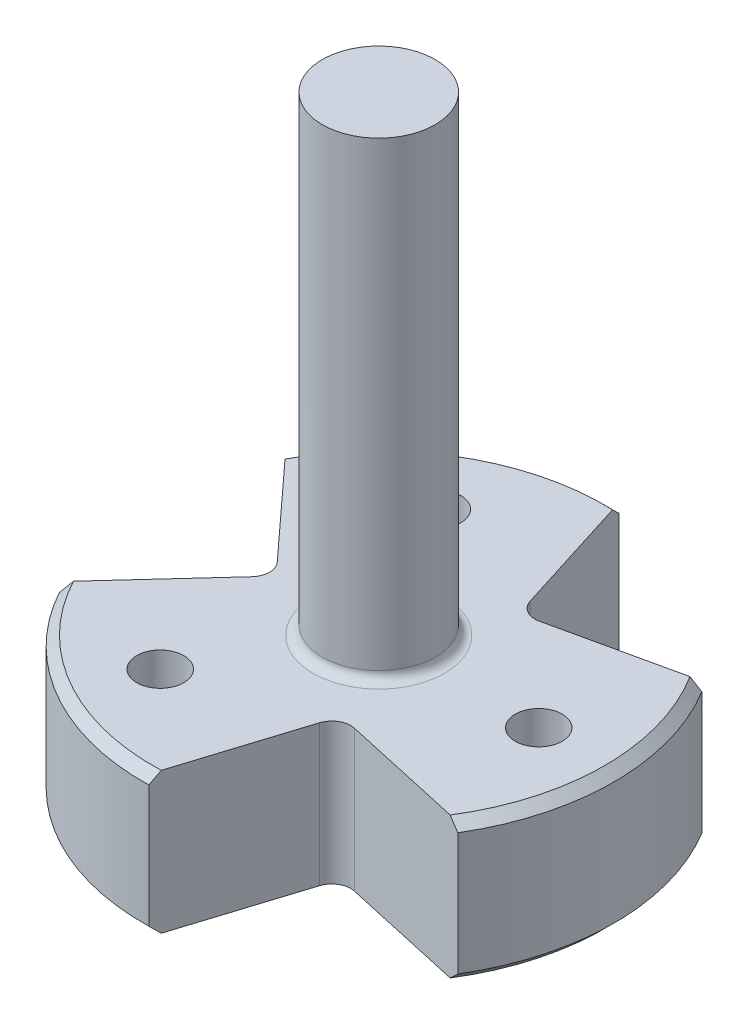
ISO-10303-21;
HEADER;
FILE_DESCRIPTION(('STEP AP214'),'2;1');
FILE_NAME('part.step','',(''),(''),'','','');
FILE_SCHEMA(('AUTOMOTIVE_DESIGN { 1 0 10303 214 1 1 1 1 }'));
ENDSEC;
DATA;
#1=APPLICATION_CONTEXT('core data for automotive mechanical design processes');
#2=APPLICATION_PROTOCOL_DEFINITION('international standard','automotive_design',2000,#1);
#3=PRODUCT_CONTEXT('',#1,'mechanical');
#4=PRODUCT('Part','Part','',(#3));
#5=PRODUCT_RELATED_PRODUCT_CATEGORY('part','',(#4));
#6=PRODUCT_DEFINITION_FORMATION('','',#4);
#7=PRODUCT_DEFINITION_CONTEXT('part definition',#1,'design');
#8=PRODUCT_DEFINITION('design','',#6,#7);
#9=PRODUCT_DEFINITION_SHAPE('','',#8);
#10=(LENGTH_UNIT() NAMED_UNIT(*) SI_UNIT(.MILLI.,.METRE.));
#11=(NAMED_UNIT(*) PLANE_ANGLE_UNIT() SI_UNIT($,.RADIAN.));
#12=(NAMED_UNIT(*) SI_UNIT($,.STERADIAN.) SOLID_ANGLE_UNIT());
#13=UNCERTAINTY_MEASURE_WITH_UNIT(LENGTH_MEASURE(1.E-05),#10,'distance_accuracy_value','');
#14=(GEOMETRIC_REPRESENTATION_CONTEXT(3) GLOBAL_UNCERTAINTY_ASSIGNED_CONTEXT((#13)) GLOBAL_UNIT_ASSIGNED_CONTEXT((#10,
#11,#12)) REPRESENTATION_CONTEXT('',''));
#15=CARTESIAN_POINT('',(0.,0.,0.));
#16=DIRECTION('',(0.,0.,1.));
#17=DIRECTION('',(1.,0.,0.));
#18=AXIS2_PLACEMENT_3D('',#15,#16,#17);
#19=CARTESIAN_POINT('',(-4.25407945152756,3.,2.83206765277555));
#20=DIRECTION('',(0.,-1.,0.));
#21=DIRECTION('',(1.,0.,0.));
#22=AXIS2_PLACEMENT_3D('',#19,#20,#21);
#23=PLANE('',#22);
#24=CARTESIAN_POINT('',(-4.25407945152756,3.,2.83206765277555));
#25=DIRECTION('',(0.,-1.,0.));
#26=DIRECTION('',(1.,0.,0.));
#27=AXIS2_PLACEMENT_3D('',#24,#25,#26);
#28=CIRCLE('',#27,5.45);
#29=CARTESIAN_POINT('',(1.19592054847244,3.,2.83206765277555));
#30=VERTEX_POINT('',#29);
#31=EDGE_CURVE('E168',#30,#30,#28,.T.);
#32=ORIENTED_EDGE('',*,*,#31,.T.);
#33=EDGE_LOOP('',(#32));
#34=FACE_BOUND('',#33,.T.);
#35=ADVANCED_FACE('F15',(#34),#23,.T.);
#36=CARTESIAN_POINT('',(-4.25407945152756,32.5,2.83206765277555));
#37=DIRECTION('',(0.,1.,0.));
#38=DIRECTION('',(-1.,0.,0.));
#39=AXIS2_PLACEMENT_3D('',#36,#37,#38);
#40=PLANE('',#39);
#41=CARTESIAN_POINT('',(-4.25407945152756,32.5,2.83206765277555));
#42=DIRECTION('',(0.,-1.,0.));
#43=DIRECTION('',(1.,0.,0.));
#44=AXIS2_PLACEMENT_3D('',#41,#42,#43);
#45=CIRCLE('',#44,3.);
#46=CARTESIAN_POINT('',(-1.25407945152756,32.5,2.83206765277555));
#47=VERTEX_POINT('',#46);
#48=EDGE_CURVE('E346',#47,#47,#45,.T.);
#49=ORIENTED_EDGE('',*,*,#48,.F.);
#50=EDGE_LOOP('',(#49));
#51=FACE_BOUND('',#50,.T.);
#52=ADVANCED_FACE('F198',(#51),#40,.T.);
#53=CARTESIAN_POINT('',(-4.25407945152756,3.,2.83206765277555));
#54=DIRECTION('',(0.,-1.,0.));
#55=DIRECTION('',(1.,0.,0.));
#56=AXIS2_PLACEMENT_3D('',#53,#54,#55);
#57=CYLINDRICAL_SURFACE('',#56,5.45);
#58=CARTESIAN_POINT('',(-4.25407945152756,0.,2.83206765277555));
#59=DIRECTION('',(0.,-1.,0.));
#60=DIRECTION('',(1.,0.,0.));
#61=AXIS2_PLACEMENT_3D('',#58,#59,#60);
#62=CIRCLE('',#61,5.45);
#63=CARTESIAN_POINT('',(1.19592054847244,0.,2.83206765277555));
#64=VERTEX_POINT('',#63);
#65=EDGE_CURVE('E356',#64,#64,#62,.F.);
#66=ORIENTED_EDGE('',*,*,#65,.F.);
#67=EDGE_LOOP('',(#66));
#68=FACE_BOUND('',#67,.T.);
#69=ORIENTED_EDGE('',*,*,#31,.F.);
#70=EDGE_LOOP('',(#69));
#71=FACE_BOUND('',#70,.T.);
#72=ADVANCED_FACE('F193',(#68,#71),#57,.F.);
#73=CARTESIAN_POINT('',(-4.25407945152756,0.499999999999996,2.83206765277555));
#74=DIRECTION('',(0.,1.,0.));
#75=DIRECTION('',(-1.,0.,0.));
#76=AXIS2_PLACEMENT_3D('',#73,#74,#75);
#77=CONICAL_SURFACE('',#76,12.4989345522635,0.785398163397452);
#78=CARTESIAN_POINT('',(-14.8554791429605,0.,-2.78796392827337));
#79=CARTESIAN_POINT('',(-14.915156095767,0.0832249289970279,-2.85306979842955));
#80=CARTESIAN_POINT('',(-14.9747984508444,0.166504060483685,-2.91813792344045));
#81=CARTESIAN_POINT('',(-15.0940139646226,0.33317072715202,-3.04819868216956));
#82=CARTESIAN_POINT('',(-15.1535871233245,0.416558262332026,-3.11319131588892));
#83=CARTESIAN_POINT('',(-15.2131256842984,0.499999999999993,-3.17814620446417));
#84=B_SPLINE_CURVE_WITH_KNOTS('',3,(#78,#79,#80,#81,#82,#83),.UNSPECIFIED.,.F.,.F.,(4,2,4),(0.,
0.364058190918852,0.728116376227242),.UNSPECIFIED.);
#85=CARTESIAN_POINT('',(-14.8554791429605,0.,-2.78796392827337));
#86=VERTEX_POINT('',#85);
#87=CARTESIAN_POINT('',(-15.2131256842984,0.499999999999993,-3.17814620446417));
#88=VERTEX_POINT('',#87);
#89=EDGE_CURVE('E177',#86,#88,#84,.T.);
#90=ORIENTED_EDGE('',*,*,#89,.T.);
#91=CARTESIAN_POINT('',(-4.25407945152756,0.499999999999994,2.83206765277555));
#92=DIRECTION('',(0.,-1.,0.));
#93=DIRECTION('',(0.,0.,-1.));
#94=AXIS2_PLACEMENT_3D('',#91,#92,#93);
#95=CIRCLE('',#94,12.4989345522635);
#96=CARTESIAN_POINT('',(-3.97955421768899,0.499999999999994,-9.66385171467202));
#97=VERTEX_POINT('',#96);
#98=EDGE_CURVE('E354',#97,#88,#95,.F.);
#99=ORIENTED_EDGE('',*,*,#98,.F.);
#100=CARTESIAN_POINT('',(-3.97955421768899,0.499999999999994,-9.66385171467202));
#101=CARTESIAN_POINT('',(-3.95307091456979,0.416558262332027,-9.57981236407621));
#102=CARTESIAN_POINT('',(-3.9265722220609,0.333170727152021,-9.49572417839703));
#103=CARTESIAN_POINT('',(-3.87354405785514,0.166504060483687,-9.32745013557532));
#104=CARTESIAN_POINT('',(-3.84701458615778,0.0832249289970301,-9.24326427843127));
#105=CARTESIAN_POINT('',(-3.82046972507027,0.,-9.15902958620236));
#106=B_SPLINE_CURVE_WITH_KNOTS('',3,(#100,#101,#102,#103,#104,#105),.UNSPECIFIED.,.F.,.F.,(4,2,
4),(0.,0.36405818530839,0.728116376227242),.UNSPECIFIED.);
#107=CARTESIAN_POINT('',(-3.82046972507027,0.,-9.15902958620236));
#108=VERTEX_POINT('',#107);
#109=EDGE_CURVE('E144',#97,#108,#106,.T.);
#110=ORIENTED_EDGE('',*,*,#109,.T.);
#111=CARTESIAN_POINT('',(-4.25407945152756,0.,2.83206765277555));
#112=DIRECTION('',(0.,1.,0.));
#113=DIRECTION('',(-1.,0.,0.));
#114=AXIS2_PLACEMENT_3D('',#111,#112,#113);
#115=CIRCLE('',#114,11.9989345522635);
#116=EDGE_CURVE('E464',#86,#108,#115,.F.);
#117=ORIENTED_EDGE('',*,*,#116,.F.);
#118=EDGE_LOOP('',(#90,#99,#110,#117));
#119=FACE_BOUND('',#118,.T.);
#120=ADVANCED_FACE('F187',(#119),#77,.T.);
#121=CARTESIAN_POINT('',(-4.25407945152756,0.499999999999992,2.83206765277555));
#122=DIRECTION('',(0.,1.,0.));
#123=DIRECTION('',(0.,0.,1.));
#124=AXIS2_PLACEMENT_3D('',#121,#122,#123);
#125=CONICAL_SURFACE('',#124,12.4989345522635,0.785398163397446);
#126=CARTESIAN_POINT('',(5.91371051344814,0.,-3.53899800515339));
#127=CARTESIAN_POINT('',(5.9999323273421,0.0832249289970256,-3.55812682722613));
#128=CARTESIAN_POINT('',(6.08610415411688,0.166504060483683,-3.57724455935926));
#129=CARTESIAN_POINT('',(6.25834783210088,0.333170727152018,-3.61545784345187));
#130=CARTESIAN_POINT('',(6.34441968331163,0.416558262332025,-3.63455339541169));
#131=CARTESIAN_POINT('',(6.43044154740475,0.499999999999992,-3.65363785743224));
#132=B_SPLINE_CURVE_WITH_KNOTS('',3,(#126,#127,#128,#129,#130,#131),.UNSPECIFIED.,.F.,.F.,(4,2,
4),(0.,0.364058190918851,0.728116376227241),.UNSPECIFIED.);
#133=CARTESIAN_POINT('',(5.91371051344814,0.,-3.53899800515339));
#134=VERTEX_POINT('',#133);
#135=CARTESIAN_POINT('',(6.43044154740475,0.499999999999992,-3.65363785743224));
#136=VERTEX_POINT('',#135);
#137=EDGE_CURVE('E410',#134,#136,#132,.T.);
#138=ORIENTED_EDGE('',*,*,#137,.T.);
#139=CARTESIAN_POINT('',(-4.25407945152756,0.49999999999999,2.83206765277555));
#140=DIRECTION('',(0.,-1.,0.));
#141=DIRECTION('',(0.,0.,-1.));
#142=AXIS2_PLACEMENT_3D('',#139,#140,#141);
#143=CIRCLE('',#142,12.4989345522635);
#144=CARTESIAN_POINT('',(6.4304415474047,0.49999999999999,9.31777316298343));
#145=VERTEX_POINT('',#144);
#146=EDGE_CURVE('E343',#145,#136,#143,.F.);
#147=ORIENTED_EDGE('',*,*,#146,.F.);
#148=CARTESIAN_POINT('',(6.4304415474047,0.49999999999999,9.31777316298343));
#149=CARTESIAN_POINT('',(6.34441968331158,0.416558262332023,9.29868870096288));
#150=CARTESIAN_POINT('',(6.25834783210083,0.333170727152016,9.27959314900306));
#151=CARTESIAN_POINT('',(6.08610415411683,0.166504060483683,9.24137986491045));
#152=CARTESIAN_POINT('',(5.99993232734205,0.0832249289970262,9.22226213277732));
#153=CARTESIAN_POINT('',(5.91371051344808,0.,9.20313331070458));
#154=B_SPLINE_CURVE_WITH_KNOTS('',3,(#148,#149,#150,#151,#152,#153),.UNSPECIFIED.,.F.,.F.,(4,2,
4),(0.,0.364058185308389,0.728116376227238),.UNSPECIFIED.);
#155=CARTESIAN_POINT('',(5.91371051344808,0.,9.20313331070458));
#156=VERTEX_POINT('',#155);
#157=EDGE_CURVE('E454',#145,#156,#154,.T.);
#158=ORIENTED_EDGE('',*,*,#157,.T.);
#159=CARTESIAN_POINT('',(-4.25407945152756,0.,2.83206765277555));
#160=DIRECTION('',(0.,1.,0.));
#161=DIRECTION('',(0.,0.,1.));
#162=AXIS2_PLACEMENT_3D('',#159,#160,#161);
#163=CIRCLE('',#162,11.9989345522635);
#164=EDGE_CURVE('E506',#134,#156,#163,.F.);
#165=ORIENTED_EDGE('',*,*,#164,.F.);
#166=EDGE_LOOP('',(#138,#147,#158,#165));
#167=FACE_BOUND('',#166,.T.);
#168=ADVANCED_FACE('F192',(#167),#125,.T.);
#169=CARTESIAN_POINT('',(-4.25407945152756,32.5,2.83206765277555));
#170=DIRECTION('',(0.,-1.,0.));
#171=DIRECTION('',(1.,0.,0.));
#172=AXIS2_PLACEMENT_3D('',#169,#170,#171);
#173=CYLINDRICAL_SURFACE('',#172,3.);
#174=ORIENTED_EDGE('',*,*,#48,.T.);
#175=EDGE_LOOP('',(#174));
#176=FACE_BOUND('',#175,.T.);
#177=CARTESIAN_POINT('',(-4.25407945152756,8.,2.83206765277555));
#178=DIRECTION('',(0.,-1.,0.));
#179=DIRECTION('',(0.,0.,-1.));
#180=AXIS2_PLACEMENT_3D('',#177,#178,#179);
#181=CIRCLE('',#180,3.);
#182=CARTESIAN_POINT('',(-4.25407945152756,8.,-0.16793234722445));
#183=VERTEX_POINT('',#182);
#184=EDGE_CURVE('E349',#183,#183,#181,.F.);
#185=ORIENTED_EDGE('',*,*,#184,.T.);
#186=EDGE_LOOP('',(#185));
#187=FACE_BOUND('',#186,.T.);
#188=ADVANCED_FACE('F574',(#176,#187),#173,.T.);
#189=CARTESIAN_POINT('',(-4.25407945152756,7.5,2.83206765277555));
#190=DIRECTION('',(0.,-1.,0.));
#191=DIRECTION('',(0.,0.,-1.));
#192=AXIS2_PLACEMENT_3D('',#189,#190,#191);
#193=CYLINDRICAL_SURFACE('',#192,12.4989345522635);
#194=DIRECTION('',(0.,1.,0.));
#195=VECTOR('',#194,1.);
#196=CARTESIAN_POINT('',(6.4304415474047,7.5,9.31777316298343));
#197=LINE('',#196,#195);
#198=CARTESIAN_POINT('',(6.4304415474047,7.00000000000001,9.31777316298343));
#199=VERTEX_POINT('',#198);
#200=EDGE_CURVE('E269',#199,#145,#197,.F.);
#201=ORIENTED_EDGE('',*,*,#200,.T.);
#202=ORIENTED_EDGE('',*,*,#146,.T.);
#203=DIRECTION('',(0.,1.,0.));
#204=VECTOR('',#203,1.);
#205=CARTESIAN_POINT('',(6.43044154740475,7.5,-3.65363785743224));
#206=LINE('',#205,#204);
#207=CARTESIAN_POINT('',(6.43044154740475,7.00000000000001,-3.65363785743224));
#208=VERTEX_POINT('',#207);
#209=EDGE_CURVE('E336',#136,#208,#206,.T.);
#210=ORIENTED_EDGE('',*,*,#209,.T.);
#211=CARTESIAN_POINT('',(-4.25407945152756,7.00000000000001,2.83206765277555));
#212=DIRECTION('',(0.,-1.,0.));
#213=DIRECTION('',(0.,0.,-1.));
#214=AXIS2_PLACEMENT_3D('',#211,#212,#213);
#215=CIRCLE('',#214,12.4989345522635);
#216=EDGE_CURVE('E333',#199,#208,#215,.F.);
#217=ORIENTED_EDGE('',*,*,#216,.F.);
#218=EDGE_LOOP('',(#201,#202,#210,#217));
#219=FACE_BOUND('',#218,.T.);
#220=ADVANCED_FACE('F572',(#219),#193,.T.);
#221=CARTESIAN_POINT('',(-0.850813049992108,7.5,8.72669797192718));
#222=DIRECTION('',(0.,-1.,0.));
#223=DIRECTION('',(0.,0.,-1.));
#224=AXIS2_PLACEMENT_3D('',#221,#222,#223);
#225=CYLINDRICAL_SURFACE('',#224,0.999999999999966);
#226=CARTESIAN_POINT('',(-0.850813049992108,7.5,8.72669797192718));
#227=DIRECTION('',(0.,-1.,0.));
#228=DIRECTION('',(0.,0.,-1.));
#229=AXIS2_PLACEMENT_3D('',#226,#227,#228);
#230=CIRCLE('',#229,0.999999999999966);
#231=CARTESIAN_POINT('',(-1.80457621470658,7.5,8.42613878368995));
#232=VERTEX_POINT('',#231);
#233=CARTESIAN_POINT('',(-0.634223359989151,7.5,7.75043524797203));
#234=VERTEX_POINT('',#233);
#235=EDGE_CURVE('E328',#232,#234,#230,.T.);
#236=ORIENTED_EDGE('',*,*,#235,.F.);
#237=DIRECTION('',(0.,1.,0.));
#238=VECTOR('',#237,1.);
#239=CARTESIAN_POINT('',(-1.80457621470658,7.5,8.42613878368995));
#240=LINE('',#239,#238);
#241=CARTESIAN_POINT('',(-1.80457621470658,0.,8.42613878368995));
#242=VERTEX_POINT('',#241);
#243=EDGE_CURVE('E265',#232,#242,#240,.F.);
#244=ORIENTED_EDGE('',*,*,#243,.T.);
#245=CARTESIAN_POINT('',(-0.850813049992108,0.,8.72669797192718));
#246=DIRECTION('',(0.,-1.,0.));
#247=DIRECTION('',(0.,0.,-1.));
#248=AXIS2_PLACEMENT_3D('',#245,#246,#247);
#249=CIRCLE('',#248,0.999999999999966);
#250=CARTESIAN_POINT('',(-0.634223359989157,0.,7.75043524797205));
#251=VERTEX_POINT('',#250);
#252=EDGE_CURVE('E487',#251,#242,#249,.F.);
#253=ORIENTED_EDGE('',*,*,#252,.F.);
#254=DIRECTION('',(0.,1.,0.));
#255=VECTOR('',#254,1.);
#256=CARTESIAN_POINT('',(-0.634223359989158,7.5,7.75043524797205));
#257=LINE('',#256,#255);
#258=EDGE_CURVE('E270',#251,#234,#257,.T.);
#259=ORIENTED_EDGE('',*,*,#258,.T.);
#260=EDGE_LOOP('',(#236,#244,#253,#259));
#261=FACE_BOUND('',#260,.T.);
#262=ADVANCED_FACE('F422',(#261),#225,.F.);
#263=CARTESIAN_POINT('',(-4.25407945152756,0.500000000000001,2.83206765277555));
#264=DIRECTION('',(0.,1.,0.));
#265=DIRECTION('',(0.,0.,1.));
#266=AXIS2_PLACEMENT_3D('',#263,#264,#265);
#267=CONICAL_SURFACE('',#266,12.4989345522635,0.785398163397448);
#268=CARTESIAN_POINT('',(-3.82046972507038,0.,14.8231648917535));
#269=CARTESIAN_POINT('',(-3.8470145861579,0.0832249289970286,14.9073995839824));
#270=CARTESIAN_POINT('',(-3.87354405785525,0.166504060483687,14.9915854411264));
#271=CARTESIAN_POINT('',(-3.92657222206102,0.333170727152025,15.1598594839481));
#272=CARTESIAN_POINT('',(-3.95307091456991,0.416558262332034,15.2439476696273));
#273=CARTESIAN_POINT('',(-3.97955421768911,0.500000000000003,15.3279870202231));
#274=B_SPLINE_CURVE_WITH_KNOTS('',3,(#268,#269,#270,#271,#272,#273),.UNSPECIFIED.,.F.,.F.,(4,2,
4),(0.,0.364058190918857,0.728116376227254),.UNSPECIFIED.);
#275=CARTESIAN_POINT('',(-3.82046972507038,0.,14.8231648917535));
#276=VERTEX_POINT('',#275);
#277=CARTESIAN_POINT('',(-3.97955421768911,0.500000000000002,15.3279870202231));
#278=VERTEX_POINT('',#277);
#279=EDGE_CURVE('E324',#276,#278,#274,.T.);
#280=ORIENTED_EDGE('',*,*,#279,.T.);
#281=CARTESIAN_POINT('',(-4.25407945152756,0.500000000000002,2.83206765277555));
#282=DIRECTION('',(0.,-1.,0.));
#283=DIRECTION('',(0.,0.,-1.));
#284=AXIS2_PLACEMENT_3D('',#281,#282,#283);
#285=CIRCLE('',#284,12.4989345522635);
#286=CARTESIAN_POINT('',(-15.2131256842985,0.500000000000002,8.84228151001516));
#287=VERTEX_POINT('',#286);
#288=EDGE_CURVE('E325',#287,#278,#285,.F.);
#289=ORIENTED_EDGE('',*,*,#288,.F.);
#290=CARTESIAN_POINT('',(-15.2131256842985,0.500000000000002,8.84228151001516));
#291=CARTESIAN_POINT('',(-15.1535871233245,0.416558262332033,8.77732662143991));
#292=CARTESIAN_POINT('',(-15.0940139646227,0.333170727152025,8.71233398772055));
#293=CARTESIAN_POINT('',(-14.9747984508444,0.166504060483688,8.58227322899145));
#294=CARTESIAN_POINT('',(-14.915156095767,0.0832249289970295,8.51720510398054));
#295=CARTESIAN_POINT('',(-14.8554791429606,0.,8.45209923382437));
#296=B_SPLINE_CURVE_WITH_KNOTS('',3,(#290,#291,#292,#293,#294,#295),.UNSPECIFIED.,.F.,.F.,(4,2,
4),(0.,0.364058185308395,0.728116376227251),.UNSPECIFIED.);
#297=CARTESIAN_POINT('',(-14.8554791429606,0.,8.45209923382437));
#298=VERTEX_POINT('',#297);
#299=EDGE_CURVE('E403',#287,#298,#296,.T.);
#300=ORIENTED_EDGE('',*,*,#299,.T.);
#301=CARTESIAN_POINT('',(-4.25407945152756,0.,2.83206765277555));
#302=DIRECTION('',(0.,1.,0.));
#303=DIRECTION('',(0.,0.,1.));
#304=AXIS2_PLACEMENT_3D('',#301,#302,#303);
#305=CIRCLE('',#304,11.9989345522635);
#306=EDGE_CURVE('E512',#276,#298,#305,.F.);
#307=ORIENTED_EDGE('',*,*,#306,.F.);
#308=EDGE_LOOP('',(#280,#289,#300,#307));
#309=FACE_BOUND('',#308,.T.);
#310=ADVANCED_FACE('F416',(#309),#267,.T.);
#311=CARTESIAN_POINT('',(-4.25407945152756,7.5,2.83206765277555));
#312=DIRECTION('',(0.,-1.,0.));
#313=DIRECTION('',(0.,0.,-1.));
#314=AXIS2_PLACEMENT_3D('',#311,#312,#313);
#315=CYLINDRICAL_SURFACE('',#314,12.4989345522635);
#316=DIRECTION('',(0.,1.,0.));
#317=VECTOR('',#316,1.);
#318=CARTESIAN_POINT('',(-3.97955421768911,7.5,15.3279870202231));
#319=LINE('',#318,#317);
#320=CARTESIAN_POINT('',(-3.97955421768911,7.,15.3279870202231));
#321=VERTEX_POINT('',#320);
#322=EDGE_CURVE('E319',#278,#321,#319,.T.);
#323=ORIENTED_EDGE('',*,*,#322,.T.);
#324=CARTESIAN_POINT('',(-4.25407945152756,7.,2.83206765277555));
#325=DIRECTION('',(0.,-1.,0.));
#326=DIRECTION('',(0.,0.,-1.));
#327=AXIS2_PLACEMENT_3D('',#324,#325,#326);
#328=CIRCLE('',#327,12.4989345522635);
#329=CARTESIAN_POINT('',(-15.2131256842985,7.,8.84228151001517));
#330=VERTEX_POINT('',#329);
#331=EDGE_CURVE('E317',#330,#321,#328,.F.);
#332=ORIENTED_EDGE('',*,*,#331,.F.);
#333=DIRECTION('',(0.,1.,0.));
#334=VECTOR('',#333,1.);
#335=CARTESIAN_POINT('',(-15.2131256842985,7.5,8.84228151001516));
#336=LINE('',#335,#334);
#337=EDGE_CURVE('E316',#330,#287,#336,.F.);
#338=ORIENTED_EDGE('',*,*,#337,.T.);
#339=ORIENTED_EDGE('',*,*,#288,.T.);
#340=EDGE_LOOP('',(#323,#332,#338,#339));
#341=FACE_BOUND('',#340,.T.);
#342=ADVANCED_FACE('F421',(#341),#315,.T.);
#343=CARTESIAN_POINT('',(-11.0606122545986,7.5,2.83206765277555));
#344=DIRECTION('',(0.,-1.,0.));
#345=DIRECTION('',(0.,0.,-1.));
#346=AXIS2_PLACEMENT_3D('',#343,#344,#345);
#347=CYLINDRICAL_SURFACE('',#346,0.999999999999998);
#348=DIRECTION('',(0.,1.,0.));
#349=VECTOR('',#348,1.);
#350=CARTESIAN_POINT('',(-10.3234387798871,7.5,3.50777118849352));
#351=LINE('',#350,#349);
#352=CARTESIAN_POINT('',(-10.3234387798871,0.,3.50777118849352));
#353=VERTEX_POINT('',#352);
#354=CARTESIAN_POINT('',(-10.3234387798871,7.5,3.50777118849352));
#355=VERTEX_POINT('',#354);
#356=EDGE_CURVE('E260',#353,#355,#351,.T.);
#357=ORIENTED_EDGE('',*,*,#356,.T.);
#358=CARTESIAN_POINT('',(-11.0606122545986,7.5,2.83206765277555));
#359=DIRECTION('',(0.,-1.,0.));
#360=DIRECTION('',(0.,0.,-1.));
#361=AXIS2_PLACEMENT_3D('',#358,#359,#360);
#362=CIRCLE('',#361,0.999999999999998);
#363=CARTESIAN_POINT('',(-10.3234387798871,7.5,2.15636411705758));
#364=VERTEX_POINT('',#363);
#365=EDGE_CURVE('E327',#364,#355,#362,.T.);
#366=ORIENTED_EDGE('',*,*,#365,.F.);
#367=DIRECTION('',(0.,1.,0.));
#368=VECTOR('',#367,1.);
#369=CARTESIAN_POINT('',(-10.3234387798871,7.5,2.15636411705758));
#370=LINE('',#369,#368);
#371=CARTESIAN_POINT('',(-10.3234387798871,0.,2.15636411705758));
#372=VERTEX_POINT('',#371);
#373=EDGE_CURVE('E255',#364,#372,#370,.F.);
#374=ORIENTED_EDGE('',*,*,#373,.T.);
#375=CARTESIAN_POINT('',(-11.0606122545986,0.,2.83206765277555));
#376=DIRECTION('',(0.,-1.,0.));
#377=DIRECTION('',(0.,0.,-1.));
#378=AXIS2_PLACEMENT_3D('',#375,#376,#377);
#379=CIRCLE('',#378,0.999999999999998);
#380=EDGE_CURVE('E353',#353,#372,#379,.F.);
#381=ORIENTED_EDGE('',*,*,#380,.F.);
#382=EDGE_LOOP('',(#357,#366,#374,#381));
#383=FACE_BOUND('',#382,.T.);
#384=ADVANCED_FACE('F475',(#383),#347,.F.);
#385=CARTESIAN_POINT('',(-0.850813049992015,7.5,-3.06256266637594));
#386=DIRECTION('',(0.,-1.,0.));
#387=DIRECTION('',(0.,0.,-1.));
#388=AXIS2_PLACEMENT_3D('',#385,#386,#387);
#389=CYLINDRICAL_SURFACE('',#388,0.999999999999955);
#390=DIRECTION('',(0.,1.,0.));
#391=VECTOR('',#390,1.);
#392=CARTESIAN_POINT('',(-1.80457621470649,7.5,-2.76200347813872));
#393=LINE('',#392,#391);
#394=CARTESIAN_POINT('',(-1.80457621470649,0.,-2.76200347813871));
#395=VERTEX_POINT('',#394);
#396=CARTESIAN_POINT('',(-1.80457621470647,7.5,-2.76200347813872));
#397=VERTEX_POINT('',#396);
#398=EDGE_CURVE('E250',#395,#397,#393,.T.);
#399=ORIENTED_EDGE('',*,*,#398,.T.);
#400=CARTESIAN_POINT('',(-0.850813049992015,7.5,-3.06256266637594));
#401=DIRECTION('',(0.,-1.,0.));
#402=DIRECTION('',(0.,0.,-1.));
#403=AXIS2_PLACEMENT_3D('',#400,#401,#402);
#404=CIRCLE('',#403,0.999999999999955);
#405=CARTESIAN_POINT('',(-0.634223359989001,7.5,-2.08629994242084));
#406=VERTEX_POINT('',#405);
#407=EDGE_CURVE('E357',#406,#397,#404,.T.);
#408=ORIENTED_EDGE('',*,*,#407,.F.);
#409=DIRECTION('',(0.,1.,0.));
#410=VECTOR('',#409,1.);
#411=CARTESIAN_POINT('',(-0.63422335998894,7.5,-2.08629994242085));
#412=LINE('',#411,#410);
#413=CARTESIAN_POINT('',(-0.634223359989001,0.,-2.08629994242084));
#414=VERTEX_POINT('',#413);
#415=EDGE_CURVE('E275',#406,#414,#412,.F.);
#416=ORIENTED_EDGE('',*,*,#415,.T.);
#417=CARTESIAN_POINT('',(-0.850813049992015,0.,-3.06256266637594));
#418=DIRECTION('',(0.,-1.,0.));
#419=DIRECTION('',(0.,0.,-1.));
#420=AXIS2_PLACEMENT_3D('',#417,#418,#419);
#421=CIRCLE('',#420,0.999999999999955);
#422=EDGE_CURVE('E502',#395,#414,#421,.F.);
#423=ORIENTED_EDGE('',*,*,#422,.F.);
#424=EDGE_LOOP('',(#399,#408,#416,#423));
#425=FACE_BOUND('',#424,.T.);
#426=ADVANCED_FACE('F501',(#425),#389,.F.);
#427=CARTESIAN_POINT('',(-4.25407945152756,7.5,2.83206765277555));
#428=DIRECTION('',(0.,-1.,0.));
#429=DIRECTION('',(0.,0.,-1.));
#430=AXIS2_PLACEMENT_3D('',#427,#428,#429);
#431=CYLINDRICAL_SURFACE('',#430,12.4989345522635);
#432=DIRECTION('',(0.,1.,0.));
#433=VECTOR('',#432,1.);
#434=CARTESIAN_POINT('',(-3.97955421768899,7.5,-9.66385171467202));
#435=LINE('',#434,#433);
#436=CARTESIAN_POINT('',(-3.97955421768899,6.99999999999999,-9.66385171467202));
#437=VERTEX_POINT('',#436);
#438=EDGE_CURVE('E302',#437,#97,#435,.F.);
#439=ORIENTED_EDGE('',*,*,#438,.T.);
#440=ORIENTED_EDGE('',*,*,#98,.T.);
#441=DIRECTION('',(0.,1.,0.));
#442=VECTOR('',#441,1.);
#443=CARTESIAN_POINT('',(-15.2131256842984,7.5,-3.17814620446417));
#444=LINE('',#443,#442);
#445=CARTESIAN_POINT('',(-15.2131256842984,6.99999999999999,-3.17814620446417));
#446=VERTEX_POINT('',#445);
#447=EDGE_CURVE('E309',#88,#446,#444,.T.);
#448=ORIENTED_EDGE('',*,*,#447,.T.);
#449=CARTESIAN_POINT('',(-4.25407945152756,6.99999999999999,2.83206765277555));
#450=DIRECTION('',(0.,-1.,0.));
#451=DIRECTION('',(0.,0.,-1.));
#452=AXIS2_PLACEMENT_3D('',#449,#450,#451);
#453=CIRCLE('',#452,12.4989345522635);
#454=EDGE_CURVE('E254',#437,#446,#453,.F.);
#455=ORIENTED_EDGE('',*,*,#454,.F.);
#456=EDGE_LOOP('',(#439,#440,#448,#455));
#457=FACE_BOUND('',#456,.T.);
#458=ADVANCED_FACE('F468',(#457),#431,.T.);
#459=CARTESIAN_POINT('',(-4.25407945152756,0.,2.83206765277555));
#460=DIRECTION('',(0.,-1.,0.));
#461=DIRECTION('',(0.,0.,-1.));
#462=AXIS2_PLACEMENT_3D('',#459,#460,#461);
#463=PLANE('',#462);
#464=DIRECTION('',(0.675703535717981,0.,-0.737173474711495));
#465=VECTOR('',#464,1.);
#466=CARTESIAN_POINT('',(-10.3234387798871,0.,3.50777118849352));
#467=LINE('',#466,#465);
#468=EDGE_CURVE('E259',#298,#353,#467,.T.);
#469=ORIENTED_EDGE('',*,*,#468,.T.);
#470=ORIENTED_EDGE('',*,*,#380,.T.);
#471=DIRECTION('',(-0.67570353571797,0.,-0.737173474711506));
#472=VECTOR('',#471,1.);
#473=CARTESIAN_POINT('',(-10.3234387798871,0.,2.15636411705758));
#474=LINE('',#473,#472);
#475=EDGE_CURVE('E258',#372,#86,#474,.T.);
#476=ORIENTED_EDGE('',*,*,#475,.T.);
#477=ORIENTED_EDGE('',*,*,#116,.T.);
#478=DIRECTION('',(0.300559188237224,0.,0.95376316471448));
#479=VECTOR('',#478,1.);
#480=CARTESIAN_POINT('',(-1.80457621470649,0.,-2.76200347813872));
#481=LINE('',#480,#479);
#482=EDGE_CURVE('E294',#108,#395,#481,.T.);
#483=ORIENTED_EDGE('',*,*,#482,.T.);
#484=ORIENTED_EDGE('',*,*,#422,.T.);
#485=DIRECTION('',(0.976262723955195,0.,-0.216589690002972));
#486=VECTOR('',#485,1.);
#487=CARTESIAN_POINT('',(-0.63422335998894,0.,-2.08629994242085));
#488=LINE('',#487,#486);
#489=EDGE_CURVE('E278',#414,#134,#488,.T.);
#490=ORIENTED_EDGE('',*,*,#489,.T.);
#491=ORIENTED_EDGE('',*,*,#164,.T.);
#492=DIRECTION('',(-0.976262723955196,0.,-0.216589690002966));
#493=VECTOR('',#492,1.);
#494=CARTESIAN_POINT('',(-0.634223359989157,0.,7.75043524797205));
#495=LINE('',#494,#493);
#496=EDGE_CURVE('E274',#156,#251,#495,.T.);
#497=ORIENTED_EDGE('',*,*,#496,.T.);
#498=ORIENTED_EDGE('',*,*,#252,.T.);
#499=DIRECTION('',(-0.300559188237233,0.,0.953763164714477));
#500=VECTOR('',#499,1.);
#501=CARTESIAN_POINT('',(-1.80457621470658,0.,8.42613878368995));
#502=LINE('',#501,#500);
#503=EDGE_CURVE('E268',#242,#276,#502,.T.);
#504=ORIENTED_EDGE('',*,*,#503,.T.);
#505=ORIENTED_EDGE('',*,*,#306,.T.);
#506=EDGE_LOOP('',(#469,#470,#476,#477,#483,#484,#490,#491,#497,#498,#504,#505));
#507=FACE_BOUND('',#506,.T.);
#508=CARTESIAN_POINT('',(-8.50407945152755,0.,10.1932835849433));
#509=DIRECTION('',(0.,1.,0.));
#510=DIRECTION('',(0.,0.,1.));
#511=AXIS2_PLACEMENT_3D('',#508,#509,#510);
#512=CIRCLE('',#511,1.24999999999999);
#513=CARTESIAN_POINT('',(-8.50407945152755,0.,11.4432835849433));
#514=VERTEX_POINT('',#513);
#515=EDGE_CURVE('E279',#514,#514,#512,.T.);
#516=ORIENTED_EDGE('',*,*,#515,.T.);
#517=EDGE_LOOP('',(#516));
#518=FACE_BOUND('',#517,.T.);
#519=CARTESIAN_POINT('',(4.24592054847243,0.,2.83206765277555));
#520=DIRECTION('',(0.,1.,0.));
#521=DIRECTION('',(0.,0.,1.));
#522=AXIS2_PLACEMENT_3D('',#519,#520,#521);
#523=CIRCLE('',#522,1.24999999999999);
#524=CARTESIAN_POINT('',(4.24592054847243,0.,4.08206765277554));
#525=VERTEX_POINT('',#524);
#526=EDGE_CURVE('E166',#525,#525,#523,.T.);
#527=ORIENTED_EDGE('',*,*,#526,.T.);
#528=EDGE_LOOP('',(#527));
#529=FACE_BOUND('',#528,.T.);
#530=CARTESIAN_POINT('',(-8.50407945152754,0.,-4.52914827939217));
#531=DIRECTION('',(0.,1.,0.));
#532=DIRECTION('',(0.,0.,1.));
#533=AXIS2_PLACEMENT_3D('',#530,#531,#532);
#534=CIRCLE('',#533,1.24999999999999);
#535=CARTESIAN_POINT('',(-8.50407945152754,0.,-3.27914827939219));
#536=VERTEX_POINT('',#535);
#537=EDGE_CURVE('E352',#536,#536,#534,.T.);
#538=ORIENTED_EDGE('',*,*,#537,.T.);
#539=EDGE_LOOP('',(#538));
#540=FACE_BOUND('',#539,.T.);
#541=ORIENTED_EDGE('',*,*,#65,.T.);
#542=EDGE_LOOP('',(#541));
#543=FACE_BOUND('',#542,.T.);
#544=ADVANCED_FACE('F287',(#507,#518,#529,#540,#543),#463,.T.);
#545=CARTESIAN_POINT('',(-4.25407945152756,8.,2.83206765277555));
#546=DIRECTION('',(0.,-1.,0.));
#547=DIRECTION('',(0.,0.,-1.));
#548=AXIS2_PLACEMENT_3D('',#545,#546,#547);
#549=TOROIDAL_SURFACE('',#548,3.5,0.5);
#550=CARTESIAN_POINT('',(-4.25407945152756,7.5,2.83206765277555));
#551=DIRECTION('',(0.,1.,0.));
#552=DIRECTION('',(0.,0.,1.));
#553=AXIS2_PLACEMENT_3D('',#550,#551,#552);
#554=CIRCLE('',#553,3.5);
#555=CARTESIAN_POINT('',(-4.25407945152756,7.5,6.33206765277555));
#556=VERTEX_POINT('',#555);
#557=CARTESIAN_POINT('',(-4.25407945152756,7.5,-0.66793234722445));
#558=VERTEX_POINT('',#557);
#559=EDGE_CURVE('E156',#556,#558,#554,.T.);
#560=ORIENTED_EDGE('',*,*,#559,.T.);
#561=CARTESIAN_POINT('',(-4.25407945152756,7.5,2.83206765277555));
#562=DIRECTION('',(0.,1.,0.));
#563=DIRECTION('',(0.,0.,-1.));
#564=AXIS2_PLACEMENT_3D('',#561,#562,#563);
#565=CIRCLE('',#564,3.5);
#566=EDGE_CURVE('E153',#558,#556,#565,.T.);
#567=ORIENTED_EDGE('',*,*,#566,.T.);
#568=EDGE_LOOP('',(#560,#567));
#569=FACE_BOUND('',#568,.T.);
#570=ORIENTED_EDGE('',*,*,#184,.F.);
#571=EDGE_LOOP('',(#570));
#572=FACE_BOUND('',#571,.T.);
#573=ADVANCED_FACE('F164',(#569,#572),#549,.F.);
#574=CARTESIAN_POINT('',(-8.50407945152754,7.5,-4.52914827939217));
#575=DIRECTION('',(0.,1.,0.));
#576=DIRECTION('',(0.,0.,1.));
#577=AXIS2_PLACEMENT_3D('',#574,#575,#576);
#578=CYLINDRICAL_SURFACE('',#577,1.24999999999999);
#579=ORIENTED_EDGE('',*,*,#537,.F.);
#580=EDGE_LOOP('',(#579));
#581=FACE_BOUND('',#580,.T.);
#582=CARTESIAN_POINT('',(-8.50407945152754,7.5,-4.52914827939217));
#583=DIRECTION('',(0.,1.,0.));
#584=DIRECTION('',(0.,0.,1.));
#585=AXIS2_PLACEMENT_3D('',#582,#583,#584);
#586=CIRCLE('',#585,1.24999999999999);
#587=CARTESIAN_POINT('',(-8.50407945152754,7.5,-3.27914827939219));
#588=VERTEX_POINT('',#587);
#589=EDGE_CURVE('E161',#588,#588,#586,.T.);
#590=ORIENTED_EDGE('',*,*,#589,.T.);
#591=EDGE_LOOP('',(#590));
#592=FACE_BOUND('',#591,.T.);
#593=ADVANCED_FACE('F286',(#581,#592),#578,.F.);
#594=CARTESIAN_POINT('',(-8.50407945152755,7.5,10.1932835849433));
#595=DIRECTION('',(0.,1.,0.));
#596=DIRECTION('',(0.,0.,1.));
#597=AXIS2_PLACEMENT_3D('',#594,#595,#596);
#598=CYLINDRICAL_SURFACE('',#597,1.24999999999999);
#599=ORIENTED_EDGE('',*,*,#515,.F.);
#600=EDGE_LOOP('',(#599));
#601=FACE_BOUND('',#600,.T.);
#602=CARTESIAN_POINT('',(-8.50407945152755,7.5,10.1932835849433));
#603=DIRECTION('',(0.,1.,0.));
#604=DIRECTION('',(0.,0.,1.));
#605=AXIS2_PLACEMENT_3D('',#602,#603,#604);
#606=CIRCLE('',#605,1.24999999999999);
#607=CARTESIAN_POINT('',(-8.50407945152755,7.5,11.4432835849433));
#608=VERTEX_POINT('',#607);
#609=EDGE_CURVE('E249',#608,#608,#606,.T.);
#610=ORIENTED_EDGE('',*,*,#609,.T.);
#611=EDGE_LOOP('',(#610));
#612=FACE_BOUND('',#611,.T.);
#613=ADVANCED_FACE('F524',(#601,#612),#598,.F.);
#614=CARTESIAN_POINT('',(-0.63422335998894,7.5,-2.08629994242085));
#615=DIRECTION('',(0.216589690002972,0.,0.976262723955195));
#616=DIRECTION('',(0.976262723955195,0.,-0.216589690002972));
#617=AXIS2_PLACEMENT_3D('',#614,#615,#616);
#618=PLANE('',#617);
#619=CARTESIAN_POINT('',(6.43044154740475,7.00000000000001,-3.65363785743224));
#620=CARTESIAN_POINT('',(6.34441968331163,7.08344173766797,-3.63455339541169));
#621=CARTESIAN_POINT('',(6.25834783210088,7.16682927284798,-3.61545784345187));
#622=CARTESIAN_POINT('',(6.08610415411688,7.33349593951632,-3.57724455935926));
#623=CARTESIAN_POINT('',(5.9999323273421,7.41677507100297,-3.55812682722613));
#624=CARTESIAN_POINT('',(5.91371051344814,7.5,-3.53899800515339));
#625=B_SPLINE_CURVE_WITH_KNOTS('',3,(#619,#620,#621,#622,#623,#624),.UNSPECIFIED.,.F.,.F.,(4,2,
4),(0.,0.364058185308391,0.728116376227242),.UNSPECIFIED.);
#626=CARTESIAN_POINT('',(5.91371051344813,7.5,-3.53899800515339));
#627=VERTEX_POINT('',#626);
#628=EDGE_CURVE('E335',#208,#627,#625,.T.);
#629=ORIENTED_EDGE('',*,*,#628,.F.);
#630=ORIENTED_EDGE('',*,*,#209,.F.);
#631=ORIENTED_EDGE('',*,*,#137,.F.);
#632=ORIENTED_EDGE('',*,*,#489,.F.);
#633=ORIENTED_EDGE('',*,*,#415,.F.);
#634=DIRECTION('',(0.976262723955194,0.,-0.216589690002973));
#635=VECTOR('',#634,1.);
#636=CARTESIAN_POINT('',(-0.63422335998894,7.5,-2.08629994242085));
#637=LINE('',#636,#635);
#638=EDGE_CURVE('E246',#406,#627,#637,.T.);
#639=ORIENTED_EDGE('',*,*,#638,.T.);
#640=EDGE_LOOP('',(#629,#630,#631,#632,#633,#639));
#641=FACE_BOUND('',#640,.T.);
#642=ADVANCED_FACE('F496',(#641),#618,.F.);
#643=CARTESIAN_POINT('',(-4.25407945152756,7.00000000000001,2.83206765277555));
#644=DIRECTION('',(0.,-1.,0.));
#645=DIRECTION('',(1.,0.,0.));
#646=AXIS2_PLACEMENT_3D('',#643,#644,#645);
#647=CONICAL_SURFACE('',#646,12.4989345522635,0.78539816339745);
#648=ORIENTED_EDGE('',*,*,#628,.T.);
#649=CARTESIAN_POINT('',(-4.25407945152756,7.5,2.83206765277555));
#650=DIRECTION('',(0.,-1.,0.));
#651=DIRECTION('',(1.,0.,0.));
#652=AXIS2_PLACEMENT_3D('',#649,#650,#651);
#653=CIRCLE('',#652,11.9989345522635);
#654=CARTESIAN_POINT('',(5.91371051344808,7.5,9.20313331070458));
#655=VERTEX_POINT('',#654);
#656=EDGE_CURVE('E245',#627,#655,#653,.T.);
#657=ORIENTED_EDGE('',*,*,#656,.T.);
#658=CARTESIAN_POINT('',(5.91371051344808,7.5,9.20313331070458));
#659=CARTESIAN_POINT('',(5.99993232734204,7.41677507100297,9.22226213277732));
#660=CARTESIAN_POINT('',(6.08610415411683,7.33349593951632,9.24137986491045));
#661=CARTESIAN_POINT('',(6.25834783210082,7.16682927284798,9.27959314900306));
#662=CARTESIAN_POINT('',(6.34441968331158,7.08344173766798,9.29868870096288));
#663=CARTESIAN_POINT('',(6.43044154740469,7.00000000000001,9.31777316298343));
#664=B_SPLINE_CURVE_WITH_KNOTS('',3,(#658,#659,#660,#661,#662,#663),.UNSPECIFIED.,.F.,.F.,(4,2,
4),(0.,0.364058190918851,0.728116376227241),.UNSPECIFIED.);
#665=EDGE_CURVE('E273',#655,#199,#664,.T.);
#666=ORIENTED_EDGE('',*,*,#665,.T.);
#667=ORIENTED_EDGE('',*,*,#216,.T.);
#668=EDGE_LOOP('',(#648,#657,#666,#667));
#669=FACE_BOUND('',#668,.T.);
#670=ADVANCED_FACE('F450',(#669),#647,.T.);
#671=CARTESIAN_POINT('',(-0.634223359989157,7.5,7.75043524797205));
#672=DIRECTION('',(0.216589690002966,0.,-0.976262723955196));
#673=DIRECTION('',(-0.976262723955196,0.,-0.216589690002966));
#674=AXIS2_PLACEMENT_3D('',#671,#672,#673);
#675=PLANE('',#674);
#676=ORIENTED_EDGE('',*,*,#665,.F.);
#677=DIRECTION('',(-0.976262723955195,0.,-0.216589690002971));
#678=VECTOR('',#677,1.);
#679=CARTESIAN_POINT('',(5.91371051344808,7.5,9.20313331070458));
#680=LINE('',#679,#678);
#681=EDGE_CURVE('E242',#655,#234,#680,.T.);
#682=ORIENTED_EDGE('',*,*,#681,.T.);
#683=ORIENTED_EDGE('',*,*,#258,.F.);
#684=ORIENTED_EDGE('',*,*,#496,.F.);
#685=ORIENTED_EDGE('',*,*,#157,.F.);
#686=ORIENTED_EDGE('',*,*,#200,.F.);
#687=EDGE_LOOP('',(#676,#682,#683,#684,#685,#686));
#688=FACE_BOUND('',#687,.T.);
#689=ADVANCED_FACE('F445',(#688),#675,.F.);
#690=CARTESIAN_POINT('',(-1.80457621470658,7.5,8.42613878368995));
#691=DIRECTION('',(-0.953763164714477,0.,-0.300559188237233));
#692=DIRECTION('',(-0.300559188237233,0.,0.953763164714477));
#693=AXIS2_PLACEMENT_3D('',#690,#691,#692);
#694=PLANE('',#693);
#695=ORIENTED_EDGE('',*,*,#279,.F.);
#696=ORIENTED_EDGE('',*,*,#503,.F.);
#697=ORIENTED_EDGE('',*,*,#243,.F.);
#698=DIRECTION('',(-0.300559188237233,0.,0.953763164714477));
#699=VECTOR('',#698,1.);
#700=CARTESIAN_POINT('',(-1.80457621470658,7.5,8.42613878368995));
#701=LINE('',#700,#699);
#702=CARTESIAN_POINT('',(-3.82046972507038,7.5,14.8231648917535));
#703=VERTEX_POINT('',#702);
#704=EDGE_CURVE('E239',#232,#703,#701,.T.);
#705=ORIENTED_EDGE('',*,*,#704,.T.);
#706=CARTESIAN_POINT('',(-3.97955421768911,7.,15.3279870202231));
#707=CARTESIAN_POINT('',(-3.95307091456991,7.08344173766797,15.2439476696273));
#708=CARTESIAN_POINT('',(-3.92657222206102,7.16682927284798,15.1598594839481));
#709=CARTESIAN_POINT('',(-3.87354405785525,7.33349593951631,14.9915854411264));
#710=CARTESIAN_POINT('',(-3.8470145861579,7.41677507100297,14.9073995839824));
#711=CARTESIAN_POINT('',(-3.82046972507038,7.5,14.8231648917534));
#712=B_SPLINE_CURVE_WITH_KNOTS('',3,(#706,#707,#708,#709,#710,#711),.UNSPECIFIED.,.F.,.F.,(4,2,
4),(0.,0.364058185308394,0.72811637622725),.UNSPECIFIED.);
#713=EDGE_CURVE('E264',#321,#703,#712,.T.);
#714=ORIENTED_EDGE('',*,*,#713,.F.);
#715=ORIENTED_EDGE('',*,*,#322,.F.);
#716=EDGE_LOOP('',(#695,#696,#697,#705,#714,#715));
#717=FACE_BOUND('',#716,.T.);
#718=ADVANCED_FACE('F442',(#717),#694,.F.);
#719=CARTESIAN_POINT('',(-4.25407945152756,7.,2.83206765277555));
#720=DIRECTION('',(0.,-1.,0.));
#721=DIRECTION('',(1.,0.,0.));
#722=AXIS2_PLACEMENT_3D('',#719,#720,#721);
#723=CONICAL_SURFACE('',#722,12.4989345522635,0.785398163397454);
#724=ORIENTED_EDGE('',*,*,#713,.T.);
#725=CARTESIAN_POINT('',(-4.25407945152756,7.5,2.83206765277555));
#726=DIRECTION('',(0.,-1.,0.));
#727=DIRECTION('',(1.,0.,0.));
#728=AXIS2_PLACEMENT_3D('',#725,#726,#727);
#729=CIRCLE('',#728,11.9989345522635);
#730=CARTESIAN_POINT('',(-14.8554791429606,7.5,8.45209923382437));
#731=VERTEX_POINT('',#730);
#732=EDGE_CURVE('E238',#703,#731,#729,.T.);
#733=ORIENTED_EDGE('',*,*,#732,.T.);
#734=CARTESIAN_POINT('',(-14.8554791429606,7.5,8.45209923382437));
#735=CARTESIAN_POINT('',(-14.915156095767,7.41677507100297,8.51720510398054));
#736=CARTESIAN_POINT('',(-14.9747984508444,7.33349593951631,8.58227322899145));
#737=CARTESIAN_POINT('',(-15.0940139646227,7.16682927284798,8.71233398772055));
#738=CARTESIAN_POINT('',(-15.1535871233245,7.08344173766797,8.77732662143991));
#739=CARTESIAN_POINT('',(-15.2131256842985,7.,8.84228151001517));
#740=B_SPLINE_CURVE_WITH_KNOTS('',3,(#734,#735,#736,#737,#738,#739),.UNSPECIFIED.,.F.,.F.,(4,2,
4),(0.,0.364058190918854,0.728116376227248),.UNSPECIFIED.);
#741=EDGE_CURVE('E263',#731,#330,#740,.T.);
#742=ORIENTED_EDGE('',*,*,#741,.T.);
#743=ORIENTED_EDGE('',*,*,#331,.T.);
#744=EDGE_LOOP('',(#724,#733,#742,#743));
#745=FACE_BOUND('',#744,.T.);
#746=ADVANCED_FACE('F393',(#745),#723,.T.);
#747=CARTESIAN_POINT('',(-10.3234387798871,7.5,3.50777118849352));
#748=DIRECTION('',(0.737173474711495,0.,0.675703535717981));
#749=DIRECTION('',(0.675703535717981,0.,-0.737173474711495));
#750=AXIS2_PLACEMENT_3D('',#747,#748,#749);
#751=PLANE('',#750);
#752=ORIENTED_EDGE('',*,*,#299,.F.);
#753=ORIENTED_EDGE('',*,*,#337,.F.);
#754=ORIENTED_EDGE('',*,*,#741,.F.);
#755=DIRECTION('',(0.675703535717981,0.,-0.737173474711495));
#756=VECTOR('',#755,1.);
#757=CARTESIAN_POINT('',(-14.8554791429606,7.5,8.45209923382437));
#758=LINE('',#757,#756);
#759=EDGE_CURVE('E235',#731,#355,#758,.T.);
#760=ORIENTED_EDGE('',*,*,#759,.T.);
#761=ORIENTED_EDGE('',*,*,#356,.F.);
#762=ORIENTED_EDGE('',*,*,#468,.F.);
#763=EDGE_LOOP('',(#752,#753,#754,#760,#761,#762));
#764=FACE_BOUND('',#763,.T.);
#765=ADVANCED_FACE('F387',(#764),#751,.F.);
#766=CARTESIAN_POINT('',(-10.3234387798871,7.5,2.15636411705758));
#767=DIRECTION('',(0.737173474711506,0.,-0.67570353571797));
#768=DIRECTION('',(-0.67570353571797,0.,-0.737173474711506));
#769=AXIS2_PLACEMENT_3D('',#766,#767,#768);
#770=PLANE('',#769);
#771=ORIENTED_EDGE('',*,*,#89,.F.);
#772=ORIENTED_EDGE('',*,*,#475,.F.);
#773=ORIENTED_EDGE('',*,*,#373,.F.);
#774=DIRECTION('',(-0.675703535717969,0.,-0.737173474711506));
#775=VECTOR('',#774,1.);
#776=CARTESIAN_POINT('',(-10.3234387798871,7.5,2.15636411705758));
#777=LINE('',#776,#775);
#778=CARTESIAN_POINT('',(-14.8554791429605,7.5,-2.78796392827336));
#779=VERTEX_POINT('',#778);
#780=EDGE_CURVE('E232',#364,#779,#777,.T.);
#781=ORIENTED_EDGE('',*,*,#780,.T.);
#782=CARTESIAN_POINT('',(-15.2131256842984,6.99999999999999,-3.17814620446417));
#783=CARTESIAN_POINT('',(-15.1535871233245,7.08344173766796,-3.11319131588892));
#784=CARTESIAN_POINT('',(-15.0940139646226,7.16682927284797,-3.04819868216956));
#785=CARTESIAN_POINT('',(-14.9747984508444,7.33349593951631,-2.91813792344045));
#786=CARTESIAN_POINT('',(-14.915156095767,7.41677507100297,-2.85306979842954));
#787=CARTESIAN_POINT('',(-14.8554791429605,7.5,-2.78796392827336));
#788=B_SPLINE_CURVE_WITH_KNOTS('',3,(#782,#783,#784,#785,#786,#787),.UNSPECIFIED.,.F.,.F.,(4,2,
4),(0.,0.364058185308403,0.728116376227267),.UNSPECIFIED.);
#789=EDGE_CURVE('E304',#446,#779,#788,.T.);
#790=ORIENTED_EDGE('',*,*,#789,.F.);
#791=ORIENTED_EDGE('',*,*,#447,.F.);
#792=EDGE_LOOP('',(#771,#772,#773,#781,#790,#791));
#793=FACE_BOUND('',#792,.T.);
#794=ADVANCED_FACE('F382',(#793),#770,.F.);
#795=CARTESIAN_POINT('',(-4.25407945152756,6.99999999999999,2.83206765277555));
#796=DIRECTION('',(0.,-1.,0.));
#797=DIRECTION('',(0.,0.,-1.));
#798=AXIS2_PLACEMENT_3D('',#795,#796,#797);
#799=CONICAL_SURFACE('',#798,12.4989345522635,0.785398163397444);
#800=CARTESIAN_POINT('',(-3.82046972507027,7.5,-9.15902958620235));
#801=CARTESIAN_POINT('',(-3.84701458615778,7.41677507100297,-9.24326427843127));
#802=CARTESIAN_POINT('',(-3.87354405785513,7.33349593951631,-9.32745013557531));
#803=CARTESIAN_POINT('',(-3.9265722220609,7.16682927284797,-9.49572417839703));
#804=CARTESIAN_POINT('',(-3.95307091456979,7.08344173766796,-9.57981236407621));
#805=CARTESIAN_POINT('',(-3.97955421768899,6.99999999999999,-9.66385171467202));
#806=B_SPLINE_CURVE_WITH_KNOTS('',3,(#800,#801,#802,#803,#804,#805),.UNSPECIFIED.,.F.,.F.,(4,2,
4),(0.,0.364058190918864,0.728116376227266),.UNSPECIFIED.);
#807=CARTESIAN_POINT('',(-3.82046972507027,7.5,-9.15902958620235));
#808=VERTEX_POINT('',#807);
#809=EDGE_CURVE('E253',#808,#437,#806,.T.);
#810=ORIENTED_EDGE('',*,*,#809,.T.);
#811=ORIENTED_EDGE('',*,*,#454,.T.);
#812=ORIENTED_EDGE('',*,*,#789,.T.);
#813=CARTESIAN_POINT('',(-4.25407945152756,7.5,2.83206765277555));
#814=DIRECTION('',(0.,-1.,0.));
#815=DIRECTION('',(0.,0.,-1.));
#816=AXIS2_PLACEMENT_3D('',#813,#814,#815);
#817=CIRCLE('',#816,11.9989345522634);
#818=EDGE_CURVE('E35',#779,#808,#817,.T.);
#819=ORIENTED_EDGE('',*,*,#818,.T.);
#820=EDGE_LOOP('',(#810,#811,#812,#819));
#821=FACE_BOUND('',#820,.T.);
#822=ADVANCED_FACE('F379',(#821),#799,.T.);
#823=CARTESIAN_POINT('',(-1.80457621470649,7.5,-2.76200347813872));
#824=DIRECTION('',(-0.95376316471448,0.,0.300559188237224));
#825=DIRECTION('',(0.300559188237224,0.,0.95376316471448));
#826=AXIS2_PLACEMENT_3D('',#823,#824,#825);
#827=PLANE('',#826);
#828=ORIENTED_EDGE('',*,*,#109,.F.);
#829=ORIENTED_EDGE('',*,*,#438,.F.);
#830=ORIENTED_EDGE('',*,*,#809,.F.);
#831=DIRECTION('',(0.30055918823723,0.,0.953763164714478));
#832=VECTOR('',#831,1.);
#833=CARTESIAN_POINT('',(-3.82046972507027,7.5,-9.15902958620235));
#834=LINE('',#833,#832);
#835=EDGE_CURVE('E26',#808,#397,#834,.T.);
#836=ORIENTED_EDGE('',*,*,#835,.T.);
#837=ORIENTED_EDGE('',*,*,#398,.F.);
#838=ORIENTED_EDGE('',*,*,#482,.F.);
#839=EDGE_LOOP('',(#828,#829,#830,#836,#837,#838));
#840=FACE_BOUND('',#839,.T.);
#841=ADVANCED_FACE('F183',(#840),#827,.F.);
#842=CARTESIAN_POINT('',(4.24592054847243,7.5,2.83206765277555));
#843=DIRECTION('',(0.,1.,0.));
#844=DIRECTION('',(0.,0.,1.));
#845=AXIS2_PLACEMENT_3D('',#842,#843,#844);
#846=CYLINDRICAL_SURFACE('',#845,1.24999999999999);
#847=ORIENTED_EDGE('',*,*,#526,.F.);
#848=EDGE_LOOP('',(#847));
#849=FACE_BOUND('',#848,.T.);
#850=CARTESIAN_POINT('',(4.24592054847243,7.5,2.83206765277555));
#851=DIRECTION('',(0.,1.,0.));
#852=DIRECTION('',(0.,0.,1.));
#853=AXIS2_PLACEMENT_3D('',#850,#851,#852);
#854=CIRCLE('',#853,1.24999999999999);
#855=CARTESIAN_POINT('',(4.24592054847243,7.5,4.08206765277554));
#856=VERTEX_POINT('',#855);
#857=EDGE_CURVE('E10',#856,#856,#854,.T.);
#858=ORIENTED_EDGE('',*,*,#857,.T.);
#859=EDGE_LOOP('',(#858));
#860=FACE_BOUND('',#859,.T.);
#861=ADVANCED_FACE('F209',(#849,#860),#846,.F.);
#862=CARTESIAN_POINT('',(-4.25407945152756,7.5,2.83206765277555));
#863=DIRECTION('',(0.,-1.,0.));
#864=DIRECTION('',(0.,0.,-1.));
#865=AXIS2_PLACEMENT_3D('',#862,#863,#864);
#866=PLANE('',#865);
#867=ORIENTED_EDGE('',*,*,#857,.F.);
#868=EDGE_LOOP('',(#867));
#869=FACE_BOUND('',#868,.T.);
#870=ORIENTED_EDGE('',*,*,#835,.F.);
#871=ORIENTED_EDGE('',*,*,#818,.F.);
#872=ORIENTED_EDGE('',*,*,#780,.F.);
#873=ORIENTED_EDGE('',*,*,#365,.T.);
#874=ORIENTED_EDGE('',*,*,#759,.F.);
#875=ORIENTED_EDGE('',*,*,#732,.F.);
#876=ORIENTED_EDGE('',*,*,#704,.F.);
#877=ORIENTED_EDGE('',*,*,#235,.T.);
#878=ORIENTED_EDGE('',*,*,#681,.F.);
#879=ORIENTED_EDGE('',*,*,#656,.F.);
#880=ORIENTED_EDGE('',*,*,#638,.F.);
#881=ORIENTED_EDGE('',*,*,#407,.T.);
#882=EDGE_LOOP('',(#870,#871,#872,#873,#874,#875,#876,#877,#878,#879,#880,#881));
#883=FACE_BOUND('',#882,.T.);
#884=ORIENTED_EDGE('',*,*,#609,.F.);
#885=EDGE_LOOP('',(#884));
#886=FACE_BOUND('',#885,.T.);
#887=ORIENTED_EDGE('',*,*,#589,.F.);
#888=EDGE_LOOP('',(#887));
#889=FACE_BOUND('',#888,.T.);
#890=ORIENTED_EDGE('',*,*,#566,.F.);
#891=ORIENTED_EDGE('',*,*,#559,.F.);
#892=EDGE_LOOP('',(#890,#891));
#893=FACE_BOUND('',#892,.T.);
#894=ADVANCED_FACE('F158',(#869,#883,#886,#889,#893),#866,.F.);
#895=CLOSED_SHELL('',(#35,#52,#72,#120,#168,#188,#220,#262,#310,#342,#384,#426,#458,#544,#573,
#593,#613,#642,#670,#689,#718,#746,#765,#794,#822,#841,#861,#894));
#896=MANIFOLD_SOLID_BREP('B1',#895);
#897=ADVANCED_BREP_SHAPE_REPRESENTATION('',(#18,#896),#14);
#898=SHAPE_DEFINITION_REPRESENTATION(#9,#897);
ENDSEC;
END-ISO-10303-21;
